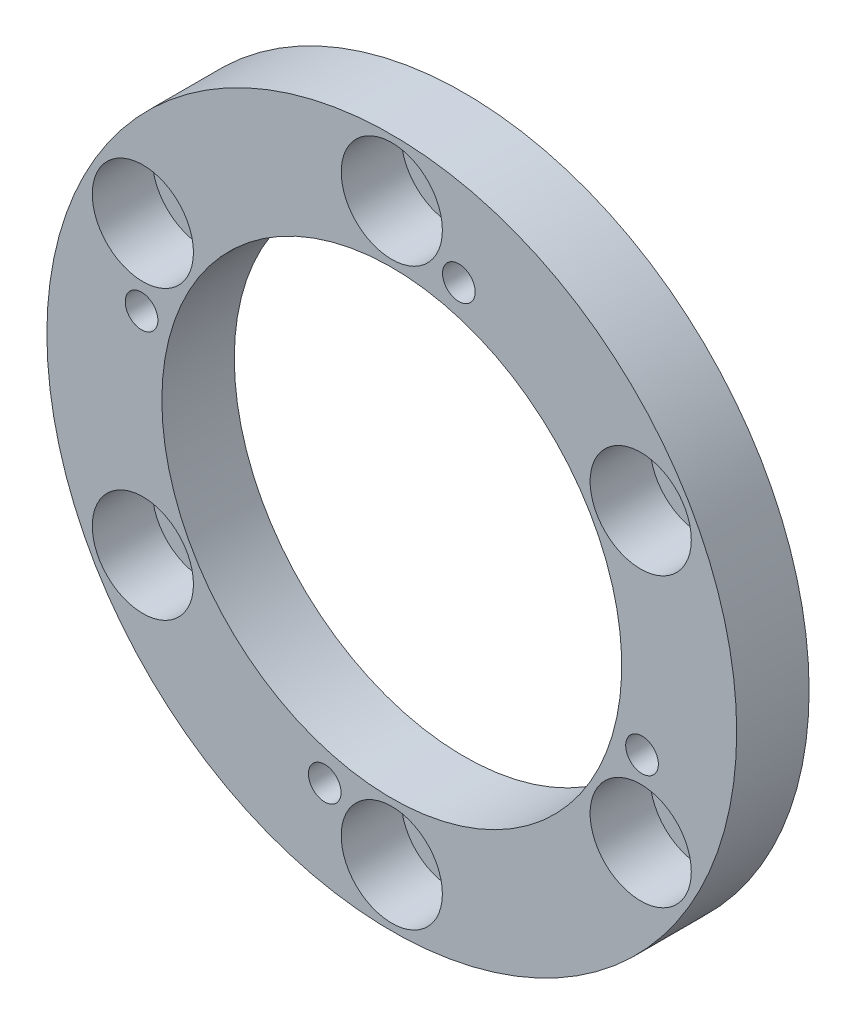
ISO-10303-21;
HEADER;
FILE_DESCRIPTION(('STEP AP214'),'2;1');
FILE_NAME('part.step','',(''),(''),'','','');
FILE_SCHEMA(('AUTOMOTIVE_DESIGN { 1 0 10303 214 1 1 1 1 }'));
ENDSEC;
DATA;
#1=APPLICATION_CONTEXT('core data for automotive mechanical design processes');
#2=APPLICATION_PROTOCOL_DEFINITION('international standard','automotive_design',2000,#1);
#3=PRODUCT_CONTEXT('',#1,'mechanical');
#4=PRODUCT('Part','Part','',(#3));
#5=PRODUCT_RELATED_PRODUCT_CATEGORY('part','',(#4));
#6=PRODUCT_DEFINITION_FORMATION('','',#4);
#7=PRODUCT_DEFINITION_CONTEXT('part definition',#1,'design');
#8=PRODUCT_DEFINITION('design','',#6,#7);
#9=PRODUCT_DEFINITION_SHAPE('','',#8);
#10=(LENGTH_UNIT() NAMED_UNIT(*) SI_UNIT(.MILLI.,.METRE.));
#11=(NAMED_UNIT(*) PLANE_ANGLE_UNIT() SI_UNIT($,.RADIAN.));
#12=(NAMED_UNIT(*) SI_UNIT($,.STERADIAN.) SOLID_ANGLE_UNIT());
#13=UNCERTAINTY_MEASURE_WITH_UNIT(LENGTH_MEASURE(1.E-05),#10,'distance_accuracy_value','');
#14=(GEOMETRIC_REPRESENTATION_CONTEXT(3) GLOBAL_UNCERTAINTY_ASSIGNED_CONTEXT((#13)) GLOBAL_UNIT_ASSIGNED_CONTEXT((#10,
#11,#12)) REPRESENTATION_CONTEXT('',''));
#15=CARTESIAN_POINT('',(0.,0.,0.));
#16=DIRECTION('',(0.,0.,1.));
#17=DIRECTION('',(1.,0.,0.));
#18=AXIS2_PLACEMENT_3D('',#15,#16,#17);
#19=CARTESIAN_POINT('',(20.6222299276168,11.9062500000002,-1.9784));
#20=DIRECTION('',(0.,0.,1.));
#21=DIRECTION('',(1.,0.,0.));
#22=AXIS2_PLACEMENT_3D('',#19,#20,#21);
#23=CYLINDRICAL_SURFACE('',#22,4.191);
#24=CARTESIAN_POINT('',(20.6222299276168,11.9062500000002,3.));
#25=DIRECTION('',(0.,0.,1.));
#26=DIRECTION('',(1.,0.,0.));
#27=AXIS2_PLACEMENT_3D('',#24,#25,#26);
#28=CIRCLE('',#27,4.191);
#29=CARTESIAN_POINT('',(24.8132299276168,11.9062500000002,3.));
#30=VERTEX_POINT('',#29);
#31=EDGE_CURVE('E109',#30,#30,#28,.F.);
#32=ORIENTED_EDGE('',*,*,#31,.F.);
#33=EDGE_LOOP('',(#32));
#34=FACE_BOUND('',#33,.T.);
#35=CARTESIAN_POINT('',(20.6222299276168,11.9062500000002,-1.9784));
#36=DIRECTION('',(0.,0.,1.));
#37=DIRECTION('',(1.,0.,0.));
#38=AXIS2_PLACEMENT_3D('',#35,#36,#37);
#39=CIRCLE('',#38,4.191);
#40=CARTESIAN_POINT('',(24.8132299276168,11.9062500000002,-1.9784));
#41=VERTEX_POINT('',#40);
#42=EDGE_CURVE('E17',#41,#41,#39,.T.);
#43=ORIENTED_EDGE('',*,*,#42,.F.);
#44=EDGE_LOOP('',(#43));
#45=FACE_BOUND('',#44,.T.);
#46=ADVANCED_FACE('F14',(#34,#45),#23,.F.);
#47=CARTESIAN_POINT('',(20.6222299276171,-11.9062499999998,-1.9784));
#48=DIRECTION('',(0.,0.,1.));
#49=DIRECTION('',(1.,0.,0.));
#50=AXIS2_PLACEMENT_3D('',#47,#48,#49);
#51=CYLINDRICAL_SURFACE('',#50,4.191);
#52=CARTESIAN_POINT('',(20.6222299276171,-11.9062499999998,3.));
#53=DIRECTION('',(0.,0.,1.));
#54=DIRECTION('',(1.,0.,0.));
#55=AXIS2_PLACEMENT_3D('',#52,#53,#54);
#56=CIRCLE('',#55,4.191);
#57=CARTESIAN_POINT('',(24.8132299276171,-11.9062499999998,3.));
#58=VERTEX_POINT('',#57);
#59=EDGE_CURVE('E106',#58,#58,#56,.F.);
#60=ORIENTED_EDGE('',*,*,#59,.F.);
#61=EDGE_LOOP('',(#60));
#62=FACE_BOUND('',#61,.T.);
#63=CARTESIAN_POINT('',(20.6222299276171,-11.9062499999998,-1.9784));
#64=DIRECTION('',(0.,0.,1.));
#65=DIRECTION('',(1.,0.,0.));
#66=AXIS2_PLACEMENT_3D('',#63,#64,#65);
#67=CIRCLE('',#66,4.191);
#68=CARTESIAN_POINT('',(24.8132299276171,-11.9062499999998,-1.9784));
#69=VERTEX_POINT('',#68);
#70=EDGE_CURVE('E123',#69,#69,#67,.T.);
#71=ORIENTED_EDGE('',*,*,#70,.F.);
#72=EDGE_LOOP('',(#71));
#73=FACE_BOUND('',#72,.T.);
#74=ADVANCED_FACE('F133',(#62,#73),#51,.F.);
#75=CARTESIAN_POINT('',(0.,-23.8125,-1.9784));
#76=DIRECTION('',(0.,0.,1.));
#77=DIRECTION('',(1.,0.,0.));
#78=AXIS2_PLACEMENT_3D('',#75,#76,#77);
#79=CYLINDRICAL_SURFACE('',#78,4.191);
#80=CARTESIAN_POINT('',(0.,-23.8125,3.));
#81=DIRECTION('',(0.,0.,1.));
#82=DIRECTION('',(1.,0.,0.));
#83=AXIS2_PLACEMENT_3D('',#80,#81,#82);
#84=CIRCLE('',#83,4.191);
#85=CARTESIAN_POINT('',(4.191,-23.8125,3.));
#86=VERTEX_POINT('',#85);
#87=EDGE_CURVE('E103',#86,#86,#84,.F.);
#88=ORIENTED_EDGE('',*,*,#87,.F.);
#89=EDGE_LOOP('',(#88));
#90=FACE_BOUND('',#89,.T.);
#91=CARTESIAN_POINT('',(0.,-23.8125,-1.9784));
#92=DIRECTION('',(0.,0.,1.));
#93=DIRECTION('',(1.,0.,0.));
#94=AXIS2_PLACEMENT_3D('',#91,#92,#93);
#95=CIRCLE('',#94,4.191);
#96=CARTESIAN_POINT('',(4.191,-23.8125,-1.9784));
#97=VERTEX_POINT('',#96);
#98=EDGE_CURVE('E121',#97,#97,#95,.T.);
#99=ORIENTED_EDGE('',*,*,#98,.F.);
#100=EDGE_LOOP('',(#99));
#101=FACE_BOUND('',#100,.T.);
#102=ADVANCED_FACE('F139',(#90,#101),#79,.F.);
#103=CARTESIAN_POINT('',(-20.6222299276169,-11.9062500000001,-1.9784));
#104=DIRECTION('',(0.,0.,1.));
#105=DIRECTION('',(1.,0.,0.));
#106=AXIS2_PLACEMENT_3D('',#103,#104,#105);
#107=CYLINDRICAL_SURFACE('',#106,4.191);
#108=CARTESIAN_POINT('',(-20.6222299276169,-11.9062500000001,3.));
#109=DIRECTION('',(0.,0.,1.));
#110=DIRECTION('',(1.,0.,0.));
#111=AXIS2_PLACEMENT_3D('',#108,#109,#110);
#112=CIRCLE('',#111,4.191);
#113=CARTESIAN_POINT('',(-16.4312299276169,-11.9062500000001,3.));
#114=VERTEX_POINT('',#113);
#115=EDGE_CURVE('E100',#114,#114,#112,.F.);
#116=ORIENTED_EDGE('',*,*,#115,.F.);
#117=EDGE_LOOP('',(#116));
#118=FACE_BOUND('',#117,.T.);
#119=CARTESIAN_POINT('',(-20.6222299276169,-11.9062500000001,-1.9784));
#120=DIRECTION('',(0.,0.,1.));
#121=DIRECTION('',(1.,0.,0.));
#122=AXIS2_PLACEMENT_3D('',#119,#120,#121);
#123=CIRCLE('',#122,4.191);
#124=CARTESIAN_POINT('',(-16.4312299276169,-11.9062500000001,-1.9784));
#125=VERTEX_POINT('',#124);
#126=EDGE_CURVE('E118',#125,#125,#123,.T.);
#127=ORIENTED_EDGE('',*,*,#126,.F.);
#128=EDGE_LOOP('',(#127));
#129=FACE_BOUND('',#128,.T.);
#130=ADVANCED_FACE('F231',(#118,#129),#107,.F.);
#131=CARTESIAN_POINT('',(-20.622229927617,11.90625,-1.9784));
#132=DIRECTION('',(0.,0.,1.));
#133=DIRECTION('',(1.,0.,0.));
#134=AXIS2_PLACEMENT_3D('',#131,#132,#133);
#135=CYLINDRICAL_SURFACE('',#134,4.191);
#136=CARTESIAN_POINT('',(-20.622229927617,11.90625,3.));
#137=DIRECTION('',(0.,0.,1.));
#138=DIRECTION('',(1.,0.,0.));
#139=AXIS2_PLACEMENT_3D('',#136,#137,#138);
#140=CIRCLE('',#139,4.191);
#141=CARTESIAN_POINT('',(-16.431229927617,11.90625,3.));
#142=VERTEX_POINT('',#141);
#143=EDGE_CURVE('E97',#142,#142,#140,.F.);
#144=ORIENTED_EDGE('',*,*,#143,.F.);
#145=EDGE_LOOP('',(#144));
#146=FACE_BOUND('',#145,.T.);
#147=CARTESIAN_POINT('',(-20.622229927617,11.90625,-1.9784));
#148=DIRECTION('',(0.,0.,1.));
#149=DIRECTION('',(1.,0.,0.));
#150=AXIS2_PLACEMENT_3D('',#147,#148,#149);
#151=CIRCLE('',#150,4.191);
#152=CARTESIAN_POINT('',(-16.431229927617,11.90625,-1.9784));
#153=VERTEX_POINT('',#152);
#154=EDGE_CURVE('E115',#153,#153,#151,.T.);
#155=ORIENTED_EDGE('',*,*,#154,.F.);
#156=EDGE_LOOP('',(#155));
#157=FACE_BOUND('',#156,.T.);
#158=ADVANCED_FACE('F227',(#146,#157),#135,.F.);
#159=CARTESIAN_POINT('',(0.,23.8125,-1.9784));
#160=DIRECTION('',(0.,0.,1.));
#161=DIRECTION('',(1.,0.,0.));
#162=AXIS2_PLACEMENT_3D('',#159,#160,#161);
#163=CYLINDRICAL_SURFACE('',#162,4.191);
#164=CARTESIAN_POINT('',(0.,23.8125,3.));
#165=DIRECTION('',(0.,0.,1.));
#166=DIRECTION('',(1.,0.,0.));
#167=AXIS2_PLACEMENT_3D('',#164,#165,#166);
#168=CIRCLE('',#167,4.191);
#169=CARTESIAN_POINT('',(4.191,23.8125,3.));
#170=VERTEX_POINT('',#169);
#171=EDGE_CURVE('E94',#170,#170,#168,.F.);
#172=ORIENTED_EDGE('',*,*,#171,.F.);
#173=EDGE_LOOP('',(#172));
#174=FACE_BOUND('',#173,.T.);
#175=CARTESIAN_POINT('',(0.,23.8125,-1.9784));
#176=DIRECTION('',(0.,0.,1.));
#177=DIRECTION('',(1.,0.,0.));
#178=AXIS2_PLACEMENT_3D('',#175,#176,#177);
#179=CIRCLE('',#178,4.191);
#180=CARTESIAN_POINT('',(4.191,23.8125,-1.9784));
#181=VERTEX_POINT('',#180);
#182=EDGE_CURVE('E112',#181,#181,#179,.T.);
#183=ORIENTED_EDGE('',*,*,#182,.F.);
#184=EDGE_LOOP('',(#183));
#185=FACE_BOUND('',#184,.T.);
#186=ADVANCED_FACE('F223',(#174,#185),#163,.F.);
#187=CARTESIAN_POINT('',(20.6222299276168,11.9062500000002,-1.9784));
#188=DIRECTION('',(0.,0.,1.));
#189=DIRECTION('',(1.,0.,0.));
#190=AXIS2_PLACEMENT_3D('',#187,#188,#189);
#191=PLANE('',#190);
#192=CARTESIAN_POINT('',(20.6222299276168,11.9062500000002,-1.9784));
#193=DIRECTION('',(0.,0.,1.));
#194=DIRECTION('',(1.,0.,0.));
#195=AXIS2_PLACEMENT_3D('',#192,#193,#194);
#196=CIRCLE('',#195,2.4892);
#197=CARTESIAN_POINT('',(23.1114299276168,11.9062500000002,-1.9784));
#198=VERTEX_POINT('',#197);
#199=EDGE_CURVE('E79',#198,#198,#196,.F.);
#200=ORIENTED_EDGE('',*,*,#199,.T.);
#201=EDGE_LOOP('',(#200));
#202=FACE_BOUND('',#201,.T.);
#203=ORIENTED_EDGE('',*,*,#42,.T.);
#204=EDGE_LOOP('',(#203));
#205=FACE_BOUND('',#204,.T.);
#206=ADVANCED_FACE('F130',(#202,#205),#191,.T.);
#207=CARTESIAN_POINT('',(20.6222299276171,-11.9062499999998,-1.9784));
#208=DIRECTION('',(0.,0.,1.));
#209=DIRECTION('',(1.,0.,0.));
#210=AXIS2_PLACEMENT_3D('',#207,#208,#209);
#211=PLANE('',#210);
#212=CARTESIAN_POINT('',(20.6222299276171,-11.9062499999998,-1.9784));
#213=DIRECTION('',(0.,0.,1.));
#214=DIRECTION('',(1.,0.,0.));
#215=AXIS2_PLACEMENT_3D('',#212,#213,#214);
#216=CIRCLE('',#215,2.4892);
#217=CARTESIAN_POINT('',(23.1114299276171,-11.9062499999998,-1.9784));
#218=VERTEX_POINT('',#217);
#219=EDGE_CURVE('E76',#218,#218,#216,.F.);
#220=ORIENTED_EDGE('',*,*,#219,.T.);
#221=EDGE_LOOP('',(#220));
#222=FACE_BOUND('',#221,.T.);
#223=ORIENTED_EDGE('',*,*,#70,.T.);
#224=EDGE_LOOP('',(#223));
#225=FACE_BOUND('',#224,.T.);
#226=ADVANCED_FACE('F216',(#222,#225),#211,.T.);
#227=CARTESIAN_POINT('',(0.,-23.8125,-1.9784));
#228=DIRECTION('',(0.,0.,1.));
#229=DIRECTION('',(1.,0.,0.));
#230=AXIS2_PLACEMENT_3D('',#227,#228,#229);
#231=PLANE('',#230);
#232=CARTESIAN_POINT('',(0.,-23.8125,-1.9784));
#233=DIRECTION('',(0.,0.,1.));
#234=DIRECTION('',(1.,0.,0.));
#235=AXIS2_PLACEMENT_3D('',#232,#233,#234);
#236=CIRCLE('',#235,2.4892);
#237=CARTESIAN_POINT('',(2.4892,-23.8125,-1.9784));
#238=VERTEX_POINT('',#237);
#239=EDGE_CURVE('E73',#238,#238,#236,.F.);
#240=ORIENTED_EDGE('',*,*,#239,.T.);
#241=EDGE_LOOP('',(#240));
#242=FACE_BOUND('',#241,.T.);
#243=ORIENTED_EDGE('',*,*,#98,.T.);
#244=EDGE_LOOP('',(#243));
#245=FACE_BOUND('',#244,.T.);
#246=ADVANCED_FACE('F212',(#242,#245),#231,.T.);
#247=CARTESIAN_POINT('',(-20.6222299276169,-11.9062500000001,-1.9784));
#248=DIRECTION('',(0.,0.,1.));
#249=DIRECTION('',(1.,0.,0.));
#250=AXIS2_PLACEMENT_3D('',#247,#248,#249);
#251=PLANE('',#250);
#252=CARTESIAN_POINT('',(-20.6222299276169,-11.9062500000001,-1.9784));
#253=DIRECTION('',(0.,0.,1.));
#254=DIRECTION('',(1.,0.,0.));
#255=AXIS2_PLACEMENT_3D('',#252,#253,#254);
#256=CIRCLE('',#255,2.4892);
#257=CARTESIAN_POINT('',(-18.1330299276169,-11.9062500000001,-1.9784));
#258=VERTEX_POINT('',#257);
#259=EDGE_CURVE('E70',#258,#258,#256,.F.);
#260=ORIENTED_EDGE('',*,*,#259,.T.);
#261=EDGE_LOOP('',(#260));
#262=FACE_BOUND('',#261,.T.);
#263=ORIENTED_EDGE('',*,*,#126,.T.);
#264=EDGE_LOOP('',(#263));
#265=FACE_BOUND('',#264,.T.);
#266=ADVANCED_FACE('F208',(#262,#265),#251,.T.);
#267=CARTESIAN_POINT('',(-20.622229927617,11.90625,-1.9784));
#268=DIRECTION('',(0.,0.,1.));
#269=DIRECTION('',(1.,0.,0.));
#270=AXIS2_PLACEMENT_3D('',#267,#268,#269);
#271=PLANE('',#270);
#272=CARTESIAN_POINT('',(-20.622229927617,11.90625,-1.9784));
#273=DIRECTION('',(0.,0.,1.));
#274=DIRECTION('',(1.,0.,0.));
#275=AXIS2_PLACEMENT_3D('',#272,#273,#274);
#276=CIRCLE('',#275,2.4892);
#277=CARTESIAN_POINT('',(-18.133029927617,11.90625,-1.9784));
#278=VERTEX_POINT('',#277);
#279=EDGE_CURVE('E67',#278,#278,#276,.F.);
#280=ORIENTED_EDGE('',*,*,#279,.T.);
#281=EDGE_LOOP('',(#280));
#282=FACE_BOUND('',#281,.T.);
#283=ORIENTED_EDGE('',*,*,#154,.T.);
#284=EDGE_LOOP('',(#283));
#285=FACE_BOUND('',#284,.T.);
#286=ADVANCED_FACE('F204',(#282,#285),#271,.T.);
#287=CARTESIAN_POINT('',(0.,23.8125,-1.9784));
#288=DIRECTION('',(0.,0.,1.));
#289=DIRECTION('',(1.,0.,0.));
#290=AXIS2_PLACEMENT_3D('',#287,#288,#289);
#291=PLANE('',#290);
#292=CARTESIAN_POINT('',(0.,23.8125,-1.9784));
#293=DIRECTION('',(0.,0.,1.));
#294=DIRECTION('',(1.,0.,0.));
#295=AXIS2_PLACEMENT_3D('',#292,#293,#294);
#296=CIRCLE('',#295,2.4892);
#297=CARTESIAN_POINT('',(2.4892,23.8125,-1.9784));
#298=VERTEX_POINT('',#297);
#299=EDGE_CURVE('E64',#298,#298,#296,.F.);
#300=ORIENTED_EDGE('',*,*,#299,.T.);
#301=EDGE_LOOP('',(#300));
#302=FACE_BOUND('',#301,.T.);
#303=ORIENTED_EDGE('',*,*,#182,.T.);
#304=EDGE_LOOP('',(#303));
#305=FACE_BOUND('',#304,.T.);
#306=ADVANCED_FACE('F200',(#302,#305),#291,.T.);
#307=CARTESIAN_POINT('',(0.,0.,3.));
#308=DIRECTION('',(0.,0.,1.));
#309=DIRECTION('',(1.,0.,0.));
#310=AXIS2_PLACEMENT_3D('',#307,#308,#309);
#311=PLANE('',#310);
#312=CARTESIAN_POINT('',(0.,0.,3.));
#313=DIRECTION('',(0.,0.,-1.));
#314=DIRECTION('',(-1.,0.,0.));
#315=AXIS2_PLACEMENT_3D('',#312,#313,#314);
#316=CIRCLE('',#315,19.05);
#317=CARTESIAN_POINT('',(-19.05,0.,3.));
#318=VERTEX_POINT('',#317);
#319=EDGE_CURVE('E58',#318,#318,#316,.T.);
#320=ORIENTED_EDGE('',*,*,#319,.T.);
#321=EDGE_LOOP('',(#320));
#322=FACE_BOUND('',#321,.T.);
#323=CARTESIAN_POINT('',(0.,0.,3.));
#324=DIRECTION('',(0.,0.,-1.));
#325=DIRECTION('',(-1.,0.,0.));
#326=AXIS2_PLACEMENT_3D('',#323,#324,#325);
#327=CIRCLE('',#326,28.575);
#328=CARTESIAN_POINT('',(-28.575,0.,3.));
#329=VERTEX_POINT('',#328);
#330=EDGE_CURVE('E61',#329,#329,#327,.T.);
#331=ORIENTED_EDGE('',*,*,#330,.F.);
#332=EDGE_LOOP('',(#331));
#333=FACE_BOUND('',#332,.T.);
#334=ORIENTED_EDGE('',*,*,#171,.T.);
#335=EDGE_LOOP('',(#334));
#336=FACE_BOUND('',#335,.T.);
#337=ORIENTED_EDGE('',*,*,#143,.T.);
#338=EDGE_LOOP('',(#337));
#339=FACE_BOUND('',#338,.T.);
#340=ORIENTED_EDGE('',*,*,#115,.T.);
#341=EDGE_LOOP('',(#340));
#342=FACE_BOUND('',#341,.T.);
#343=ORIENTED_EDGE('',*,*,#87,.T.);
#344=EDGE_LOOP('',(#343));
#345=FACE_BOUND('',#344,.T.);
#346=ORIENTED_EDGE('',*,*,#59,.T.);
#347=EDGE_LOOP('',(#346));
#348=FACE_BOUND('',#347,.T.);
#349=ORIENTED_EDGE('',*,*,#31,.T.);
#350=EDGE_LOOP('',(#349));
#351=FACE_BOUND('',#350,.T.);
#352=CARTESIAN_POINT('',(20.7316660096423,-5.55503316503534,3.));
#353=DIRECTION('',(0.,0.,1.));
#354=DIRECTION('',(1.,0.,0.));
#355=AXIS2_PLACEMENT_3D('',#352,#353,#354);
#356=CIRCLE('',#355,1.35255);
#357=CARTESIAN_POINT('',(22.0842160096423,-5.55503316503534,3.));
#358=VERTEX_POINT('',#357);
#359=EDGE_CURVE('E82',#358,#358,#356,.F.);
#360=ORIENTED_EDGE('',*,*,#359,.T.);
#361=EDGE_LOOP('',(#360));
#362=FACE_BOUND('',#361,.T.);
#363=CARTESIAN_POINT('',(-20.7316660096423,5.55503316503533,3.));
#364=DIRECTION('',(0.,0.,1.));
#365=DIRECTION('',(1.,0.,0.));
#366=AXIS2_PLACEMENT_3D('',#363,#364,#365);
#367=CIRCLE('',#366,1.35255);
#368=CARTESIAN_POINT('',(-19.3791160096423,5.55503316503533,3.));
#369=VERTEX_POINT('',#368);
#370=EDGE_CURVE('E85',#369,#369,#367,.F.);
#371=ORIENTED_EDGE('',*,*,#370,.T.);
#372=EDGE_LOOP('',(#371));
#373=FACE_BOUND('',#372,.T.);
#374=CARTESIAN_POINT('',(-5.55503316503533,-20.7316660096423,3.));
#375=DIRECTION('',(0.,0.,1.));
#376=DIRECTION('',(1.,0.,0.));
#377=AXIS2_PLACEMENT_3D('',#374,#375,#376);
#378=CIRCLE('',#377,1.35255);
#379=CARTESIAN_POINT('',(-4.20248316503533,-20.7316660096423,3.));
#380=VERTEX_POINT('',#379);
#381=EDGE_CURVE('E88',#380,#380,#378,.F.);
#382=ORIENTED_EDGE('',*,*,#381,.T.);
#383=EDGE_LOOP('',(#382));
#384=FACE_BOUND('',#383,.T.);
#385=CARTESIAN_POINT('',(5.55503316503534,20.7316660096423,3.));
#386=DIRECTION('',(0.,0.,1.));
#387=DIRECTION('',(1.,0.,0.));
#388=AXIS2_PLACEMENT_3D('',#385,#386,#387);
#389=CIRCLE('',#388,1.35255);
#390=CARTESIAN_POINT('',(6.90758316503534,20.7316660096423,3.));
#391=VERTEX_POINT('',#390);
#392=EDGE_CURVE('E91',#391,#391,#389,.F.);
#393=ORIENTED_EDGE('',*,*,#392,.T.);
#394=EDGE_LOOP('',(#393));
#395=FACE_BOUND('',#394,.T.);
#396=ADVANCED_FACE('F196',(#322,#333,#336,#339,#342,#345,#348,#351,#362,#373,#384,#395),#311,.T.);
#397=CARTESIAN_POINT('',(5.55503316503534,20.7316660096423,3.));
#398=DIRECTION('',(0.,0.,1.));
#399=DIRECTION('',(1.,0.,0.));
#400=AXIS2_PLACEMENT_3D('',#397,#398,#399);
#401=CYLINDRICAL_SURFACE('',#400,1.35255);
#402=CARTESIAN_POINT('',(5.55503316503534,20.7316660096423,-3.));
#403=DIRECTION('',(0.,0.,1.));
#404=DIRECTION('',(1.,0.,0.));
#405=AXIS2_PLACEMENT_3D('',#402,#403,#404);
#406=CIRCLE('',#405,1.35255);
#407=CARTESIAN_POINT('',(6.90758316503534,20.7316660096423,-3.));
#408=VERTEX_POINT('',#407);
#409=EDGE_CURVE('E55',#408,#408,#406,.F.);
#410=ORIENTED_EDGE('',*,*,#409,.T.);
#411=EDGE_LOOP('',(#410));
#412=FACE_BOUND('',#411,.T.);
#413=ORIENTED_EDGE('',*,*,#392,.F.);
#414=EDGE_LOOP('',(#413));
#415=FACE_BOUND('',#414,.T.);
#416=ADVANCED_FACE('F192',(#412,#415),#401,.F.);
#417=CARTESIAN_POINT('',(-5.55503316503533,-20.7316660096423,3.));
#418=DIRECTION('',(0.,0.,1.));
#419=DIRECTION('',(1.,0.,0.));
#420=AXIS2_PLACEMENT_3D('',#417,#418,#419);
#421=CYLINDRICAL_SURFACE('',#420,1.35255);
#422=CARTESIAN_POINT('',(-5.55503316503533,-20.7316660096423,-3.));
#423=DIRECTION('',(0.,0.,1.));
#424=DIRECTION('',(1.,0.,0.));
#425=AXIS2_PLACEMENT_3D('',#422,#423,#424);
#426=CIRCLE('',#425,1.35255);
#427=CARTESIAN_POINT('',(-4.20248316503533,-20.7316660096423,-3.));
#428=VERTEX_POINT('',#427);
#429=EDGE_CURVE('E52',#428,#428,#426,.F.);
#430=ORIENTED_EDGE('',*,*,#429,.T.);
#431=EDGE_LOOP('',(#430));
#432=FACE_BOUND('',#431,.T.);
#433=ORIENTED_EDGE('',*,*,#381,.F.);
#434=EDGE_LOOP('',(#433));
#435=FACE_BOUND('',#434,.T.);
#436=ADVANCED_FACE('F188',(#432,#435),#421,.F.);
#437=CARTESIAN_POINT('',(-20.7316660096423,5.55503316503533,3.));
#438=DIRECTION('',(0.,0.,1.));
#439=DIRECTION('',(1.,0.,0.));
#440=AXIS2_PLACEMENT_3D('',#437,#438,#439);
#441=CYLINDRICAL_SURFACE('',#440,1.35255);
#442=CARTESIAN_POINT('',(-20.7316660096423,5.55503316503533,-3.));
#443=DIRECTION('',(0.,0.,1.));
#444=DIRECTION('',(1.,0.,0.));
#445=AXIS2_PLACEMENT_3D('',#442,#443,#444);
#446=CIRCLE('',#445,1.35255);
#447=CARTESIAN_POINT('',(-19.3791160096423,5.55503316503533,-3.));
#448=VERTEX_POINT('',#447);
#449=EDGE_CURVE('E49',#448,#448,#446,.F.);
#450=ORIENTED_EDGE('',*,*,#449,.T.);
#451=EDGE_LOOP('',(#450));
#452=FACE_BOUND('',#451,.T.);
#453=ORIENTED_EDGE('',*,*,#370,.F.);
#454=EDGE_LOOP('',(#453));
#455=FACE_BOUND('',#454,.T.);
#456=ADVANCED_FACE('F184',(#452,#455),#441,.F.);
#457=CARTESIAN_POINT('',(20.7316660096423,-5.55503316503534,3.));
#458=DIRECTION('',(0.,0.,1.));
#459=DIRECTION('',(1.,0.,0.));
#460=AXIS2_PLACEMENT_3D('',#457,#458,#459);
#461=CYLINDRICAL_SURFACE('',#460,1.35255);
#462=CARTESIAN_POINT('',(20.7316660096423,-5.55503316503534,-3.));
#463=DIRECTION('',(0.,0.,1.));
#464=DIRECTION('',(1.,0.,0.));
#465=AXIS2_PLACEMENT_3D('',#462,#463,#464);
#466=CIRCLE('',#465,1.35255);
#467=CARTESIAN_POINT('',(22.0842160096423,-5.55503316503534,-3.));
#468=VERTEX_POINT('',#467);
#469=EDGE_CURVE('E46',#468,#468,#466,.F.);
#470=ORIENTED_EDGE('',*,*,#469,.T.);
#471=EDGE_LOOP('',(#470));
#472=FACE_BOUND('',#471,.T.);
#473=ORIENTED_EDGE('',*,*,#359,.F.);
#474=EDGE_LOOP('',(#473));
#475=FACE_BOUND('',#474,.T.);
#476=ADVANCED_FACE('F180',(#472,#475),#461,.F.);
#477=CARTESIAN_POINT('',(20.6222299276168,11.9062500000002,-3.));
#478=DIRECTION('',(0.,0.,1.));
#479=DIRECTION('',(1.,0.,0.));
#480=AXIS2_PLACEMENT_3D('',#477,#478,#479);
#481=CYLINDRICAL_SURFACE('',#480,2.4892);
#482=CARTESIAN_POINT('',(20.6222299276168,11.9062500000002,-3.));
#483=DIRECTION('',(0.,0.,1.));
#484=DIRECTION('',(1.,0.,0.));
#485=AXIS2_PLACEMENT_3D('',#482,#483,#484);
#486=CIRCLE('',#485,2.4892);
#487=CARTESIAN_POINT('',(23.1114299276168,11.9062500000002,-3.));
#488=VERTEX_POINT('',#487);
#489=EDGE_CURVE('E43',#488,#488,#486,.F.);
#490=ORIENTED_EDGE('',*,*,#489,.T.);
#491=EDGE_LOOP('',(#490));
#492=FACE_BOUND('',#491,.T.);
#493=ORIENTED_EDGE('',*,*,#199,.F.);
#494=EDGE_LOOP('',(#493));
#495=FACE_BOUND('',#494,.T.);
#496=ADVANCED_FACE('F176',(#492,#495),#481,.F.);
#497=CARTESIAN_POINT('',(20.6222299276171,-11.9062499999998,-3.));
#498=DIRECTION('',(0.,0.,1.));
#499=DIRECTION('',(1.,0.,0.));
#500=AXIS2_PLACEMENT_3D('',#497,#498,#499);
#501=CYLINDRICAL_SURFACE('',#500,2.4892);
#502=CARTESIAN_POINT('',(20.6222299276171,-11.9062499999998,-3.));
#503=DIRECTION('',(0.,0.,1.));
#504=DIRECTION('',(1.,0.,0.));
#505=AXIS2_PLACEMENT_3D('',#502,#503,#504);
#506=CIRCLE('',#505,2.4892);
#507=CARTESIAN_POINT('',(23.1114299276171,-11.9062499999998,-3.));
#508=VERTEX_POINT('',#507);
#509=EDGE_CURVE('E40',#508,#508,#506,.F.);
#510=ORIENTED_EDGE('',*,*,#509,.T.);
#511=EDGE_LOOP('',(#510));
#512=FACE_BOUND('',#511,.T.);
#513=ORIENTED_EDGE('',*,*,#219,.F.);
#514=EDGE_LOOP('',(#513));
#515=FACE_BOUND('',#514,.T.);
#516=ADVANCED_FACE('F172',(#512,#515),#501,.F.);
#517=CARTESIAN_POINT('',(0.,-23.8125,-3.));
#518=DIRECTION('',(0.,0.,1.));
#519=DIRECTION('',(1.,0.,0.));
#520=AXIS2_PLACEMENT_3D('',#517,#518,#519);
#521=CYLINDRICAL_SURFACE('',#520,2.4892);
#522=CARTESIAN_POINT('',(0.,-23.8125,-3.));
#523=DIRECTION('',(0.,0.,1.));
#524=DIRECTION('',(1.,0.,0.));
#525=AXIS2_PLACEMENT_3D('',#522,#523,#524);
#526=CIRCLE('',#525,2.4892);
#527=CARTESIAN_POINT('',(2.4892,-23.8125,-3.));
#528=VERTEX_POINT('',#527);
#529=EDGE_CURVE('E37',#528,#528,#526,.F.);
#530=ORIENTED_EDGE('',*,*,#529,.T.);
#531=EDGE_LOOP('',(#530));
#532=FACE_BOUND('',#531,.T.);
#533=ORIENTED_EDGE('',*,*,#239,.F.);
#534=EDGE_LOOP('',(#533));
#535=FACE_BOUND('',#534,.T.);
#536=ADVANCED_FACE('F168',(#532,#535),#521,.F.);
#537=CARTESIAN_POINT('',(-20.6222299276169,-11.9062500000001,-3.));
#538=DIRECTION('',(0.,0.,1.));
#539=DIRECTION('',(1.,0.,0.));
#540=AXIS2_PLACEMENT_3D('',#537,#538,#539);
#541=CYLINDRICAL_SURFACE('',#540,2.4892);
#542=CARTESIAN_POINT('',(-20.6222299276169,-11.9062500000001,-3.));
#543=DIRECTION('',(0.,0.,1.));
#544=DIRECTION('',(1.,0.,0.));
#545=AXIS2_PLACEMENT_3D('',#542,#543,#544);
#546=CIRCLE('',#545,2.4892);
#547=CARTESIAN_POINT('',(-18.1330299276169,-11.9062500000001,-3.));
#548=VERTEX_POINT('',#547);
#549=EDGE_CURVE('E34',#548,#548,#546,.F.);
#550=ORIENTED_EDGE('',*,*,#549,.T.);
#551=EDGE_LOOP('',(#550));
#552=FACE_BOUND('',#551,.T.);
#553=ORIENTED_EDGE('',*,*,#259,.F.);
#554=EDGE_LOOP('',(#553));
#555=FACE_BOUND('',#554,.T.);
#556=ADVANCED_FACE('F164',(#552,#555),#541,.F.);
#557=CARTESIAN_POINT('',(-20.622229927617,11.90625,-3.));
#558=DIRECTION('',(0.,0.,1.));
#559=DIRECTION('',(1.,0.,0.));
#560=AXIS2_PLACEMENT_3D('',#557,#558,#559);
#561=CYLINDRICAL_SURFACE('',#560,2.4892);
#562=CARTESIAN_POINT('',(-20.622229927617,11.90625,-3.));
#563=DIRECTION('',(0.,0.,1.));
#564=DIRECTION('',(1.,0.,0.));
#565=AXIS2_PLACEMENT_3D('',#562,#563,#564);
#566=CIRCLE('',#565,2.4892);
#567=CARTESIAN_POINT('',(-18.133029927617,11.90625,-3.));
#568=VERTEX_POINT('',#567);
#569=EDGE_CURVE('E31',#568,#568,#566,.F.);
#570=ORIENTED_EDGE('',*,*,#569,.T.);
#571=EDGE_LOOP('',(#570));
#572=FACE_BOUND('',#571,.T.);
#573=ORIENTED_EDGE('',*,*,#279,.F.);
#574=EDGE_LOOP('',(#573));
#575=FACE_BOUND('',#574,.T.);
#576=ADVANCED_FACE('F160',(#572,#575),#561,.F.);
#577=CARTESIAN_POINT('',(0.,23.8125,-3.));
#578=DIRECTION('',(0.,0.,1.));
#579=DIRECTION('',(1.,0.,0.));
#580=AXIS2_PLACEMENT_3D('',#577,#578,#579);
#581=CYLINDRICAL_SURFACE('',#580,2.4892);
#582=CARTESIAN_POINT('',(0.,23.8125,-3.));
#583=DIRECTION('',(0.,0.,1.));
#584=DIRECTION('',(1.,0.,0.));
#585=AXIS2_PLACEMENT_3D('',#582,#583,#584);
#586=CIRCLE('',#585,2.4892);
#587=CARTESIAN_POINT('',(2.4892,23.8125,-3.));
#588=VERTEX_POINT('',#587);
#589=EDGE_CURVE('E26',#588,#588,#586,.F.);
#590=ORIENTED_EDGE('',*,*,#589,.T.);
#591=EDGE_LOOP('',(#590));
#592=FACE_BOUND('',#591,.T.);
#593=ORIENTED_EDGE('',*,*,#299,.F.);
#594=EDGE_LOOP('',(#593));
#595=FACE_BOUND('',#594,.T.);
#596=ADVANCED_FACE('F156',(#592,#595),#581,.F.);
#597=CARTESIAN_POINT('',(0.,0.,3.));
#598=DIRECTION('',(0.,0.,-1.));
#599=DIRECTION('',(-1.,0.,0.));
#600=AXIS2_PLACEMENT_3D('',#597,#598,#599);
#601=CYLINDRICAL_SURFACE('',#600,28.575);
#602=ORIENTED_EDGE('',*,*,#330,.T.);
#603=EDGE_LOOP('',(#602));
#604=FACE_BOUND('',#603,.T.);
#605=CARTESIAN_POINT('',(0.,0.,-3.));
#606=DIRECTION('',(0.,0.,-1.));
#607=DIRECTION('',(-1.,0.,0.));
#608=AXIS2_PLACEMENT_3D('',#605,#606,#607);
#609=CIRCLE('',#608,28.575);
#610=CARTESIAN_POINT('',(-28.575,0.,-3.));
#611=VERTEX_POINT('',#610);
#612=EDGE_CURVE('E21',#611,#611,#609,.F.);
#613=ORIENTED_EDGE('',*,*,#612,.T.);
#614=EDGE_LOOP('',(#613));
#615=FACE_BOUND('',#614,.T.);
#616=ADVANCED_FACE('F150',(#604,#615),#601,.T.);
#617=CARTESIAN_POINT('',(0.,0.,3.));
#618=DIRECTION('',(0.,0.,-1.));
#619=DIRECTION('',(-1.,0.,0.));
#620=AXIS2_PLACEMENT_3D('',#617,#618,#619);
#621=CYLINDRICAL_SURFACE('',#620,19.05);
#622=CARTESIAN_POINT('',(0.,0.,-3.));
#623=DIRECTION('',(0.,0.,-1.));
#624=DIRECTION('',(-1.,0.,0.));
#625=AXIS2_PLACEMENT_3D('',#622,#623,#624);
#626=CIRCLE('',#625,19.05);
#627=CARTESIAN_POINT('',(-19.05,0.,-3.));
#628=VERTEX_POINT('',#627);
#629=EDGE_CURVE('E10',#628,#628,#626,.T.);
#630=ORIENTED_EDGE('',*,*,#629,.T.);
#631=EDGE_LOOP('',(#630));
#632=FACE_BOUND('',#631,.T.);
#633=ORIENTED_EDGE('',*,*,#319,.F.);
#634=EDGE_LOOP('',(#633));
#635=FACE_BOUND('',#634,.T.);
#636=ADVANCED_FACE('F144',(#632,#635),#621,.F.);
#637=CARTESIAN_POINT('',(0.,0.,-3.));
#638=DIRECTION('',(0.,0.,1.));
#639=DIRECTION('',(1.,0.,0.));
#640=AXIS2_PLACEMENT_3D('',#637,#638,#639);
#641=PLANE('',#640);
#642=ORIENTED_EDGE('',*,*,#629,.F.);
#643=EDGE_LOOP('',(#642));
#644=FACE_BOUND('',#643,.T.);
#645=ORIENTED_EDGE('',*,*,#612,.F.);
#646=EDGE_LOOP('',(#645));
#647=FACE_BOUND('',#646,.T.);
#648=ORIENTED_EDGE('',*,*,#589,.F.);
#649=EDGE_LOOP('',(#648));
#650=FACE_BOUND('',#649,.T.);
#651=ORIENTED_EDGE('',*,*,#569,.F.);
#652=EDGE_LOOP('',(#651));
#653=FACE_BOUND('',#652,.T.);
#654=ORIENTED_EDGE('',*,*,#549,.F.);
#655=EDGE_LOOP('',(#654));
#656=FACE_BOUND('',#655,.T.);
#657=ORIENTED_EDGE('',*,*,#529,.F.);
#658=EDGE_LOOP('',(#657));
#659=FACE_BOUND('',#658,.T.);
#660=ORIENTED_EDGE('',*,*,#509,.F.);
#661=EDGE_LOOP('',(#660));
#662=FACE_BOUND('',#661,.T.);
#663=ORIENTED_EDGE('',*,*,#489,.F.);
#664=EDGE_LOOP('',(#663));
#665=FACE_BOUND('',#664,.T.);
#666=ORIENTED_EDGE('',*,*,#469,.F.);
#667=EDGE_LOOP('',(#666));
#668=FACE_BOUND('',#667,.T.);
#669=ORIENTED_EDGE('',*,*,#449,.F.);
#670=EDGE_LOOP('',(#669));
#671=FACE_BOUND('',#670,.T.);
#672=ORIENTED_EDGE('',*,*,#429,.F.);
#673=EDGE_LOOP('',(#672));
#674=FACE_BOUND('',#673,.T.);
#675=ORIENTED_EDGE('',*,*,#409,.F.);
#676=EDGE_LOOP('',(#675));
#677=FACE_BOUND('',#676,.T.);
#678=ADVANCED_FACE('F142',(#644,#647,#650,#653,#656,#659,#662,#665,#668,#671,#674,#677),#641,.F.);
#679=CLOSED_SHELL('',(#46,#74,#102,#130,#158,#186,#206,#226,#246,#266,#286,#306,#396,#416,#436,
#456,#476,#496,#516,#536,#556,#576,#596,#616,#636,#678));
#680=MANIFOLD_SOLID_BREP('B1',#679);
#681=ADVANCED_BREP_SHAPE_REPRESENTATION('',(#18,#680),#14);
#682=SHAPE_DEFINITION_REPRESENTATION(#9,#681);
ENDSEC;
END-ISO-10303-21;
